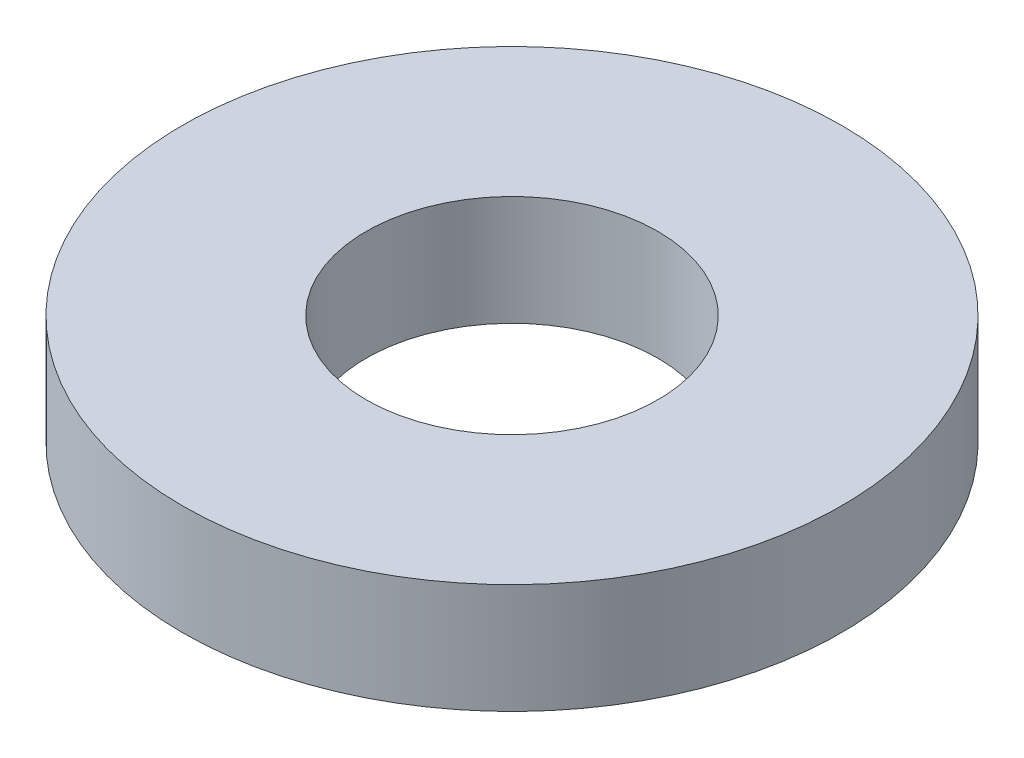
ISO-10303-21;
HEADER;
FILE_DESCRIPTION(('STEP AP214'),'2;1');
FILE_NAME('part.step','',(''),(''),'','','');
FILE_SCHEMA(('AUTOMOTIVE_DESIGN { 1 0 10303 214 1 1 1 1 }'));
ENDSEC;
DATA;
#1=APPLICATION_CONTEXT('core data for automotive mechanical design processes');
#2=APPLICATION_PROTOCOL_DEFINITION('international standard','automotive_design',2000,#1);
#3=PRODUCT_CONTEXT('',#1,'mechanical');
#4=PRODUCT('Part','Part','',(#3));
#5=PRODUCT_RELATED_PRODUCT_CATEGORY('part','',(#4));
#6=PRODUCT_DEFINITION_FORMATION('','',#4);
#7=PRODUCT_DEFINITION_CONTEXT('part definition',#1,'design');
#8=PRODUCT_DEFINITION('design','',#6,#7);
#9=PRODUCT_DEFINITION_SHAPE('','',#8);
#10=(LENGTH_UNIT() NAMED_UNIT(*) SI_UNIT(.MILLI.,.METRE.));
#11=(NAMED_UNIT(*) PLANE_ANGLE_UNIT() SI_UNIT($,.RADIAN.));
#12=(NAMED_UNIT(*) SI_UNIT($,.STERADIAN.) SOLID_ANGLE_UNIT());
#13=UNCERTAINTY_MEASURE_WITH_UNIT(LENGTH_MEASURE(1.E-05),#10,'distance_accuracy_value','');
#14=(GEOMETRIC_REPRESENTATION_CONTEXT(3) GLOBAL_UNCERTAINTY_ASSIGNED_CONTEXT((#13)) GLOBAL_UNIT_ASSIGNED_CONTEXT((#10,
#11,#12)) REPRESENTATION_CONTEXT('',''));
#15=CARTESIAN_POINT('',(0.,0.,0.));
#16=DIRECTION('',(0.,0.,1.));
#17=DIRECTION('',(1.,0.,0.));
#18=AXIS2_PLACEMENT_3D('',#15,#16,#17);
#19=CARTESIAN_POINT('',(0.,1.5875,0.));
#20=DIRECTION('',(0.,1.,0.));
#21=DIRECTION('',(0.,0.,1.));
#22=AXIS2_PLACEMENT_3D('',#19,#20,#21);
#23=PLANE('',#22);
#24=CARTESIAN_POINT('',(0.,1.5875,0.));
#25=DIRECTION('',(0.,1.,0.));
#26=DIRECTION('',(0.,0.,1.));
#27=AXIS2_PLACEMENT_3D('',#24,#25,#26);
#28=CIRCLE('',#27,4.7625);
#29=CARTESIAN_POINT('',(0.,1.5875,4.7625));
#30=VERTEX_POINT('',#29);
#31=EDGE_CURVE('E10',#30,#30,#28,.T.);
#32=ORIENTED_EDGE('',*,*,#31,.T.);
#33=EDGE_LOOP('',(#32));
#34=FACE_BOUND('',#33,.T.);
#35=CARTESIAN_POINT('',(0.,1.5875,0.));
#36=DIRECTION('',(0.,1.,0.));
#37=DIRECTION('',(0.,0.,1.));
#38=AXIS2_PLACEMENT_3D('',#35,#36,#37);
#39=CIRCLE('',#38,2.1082);
#40=CARTESIAN_POINT('',(0.,1.5875,2.1082));
#41=VERTEX_POINT('',#40);
#42=EDGE_CURVE('E45',#41,#41,#39,.T.);
#43=ORIENTED_EDGE('',*,*,#42,.F.);
#44=EDGE_LOOP('',(#43));
#45=FACE_BOUND('',#44,.T.);
#46=ADVANCED_FACE('F34',(#34,#45),#23,.T.);
#47=CARTESIAN_POINT('',(0.,0.,0.));
#48=DIRECTION('',(0.,1.,0.));
#49=DIRECTION('',(0.,0.,1.));
#50=AXIS2_PLACEMENT_3D('',#47,#48,#49);
#51=PLANE('',#50);
#52=CARTESIAN_POINT('',(0.,0.,0.));
#53=DIRECTION('',(0.,1.,0.));
#54=DIRECTION('',(0.,0.,1.));
#55=AXIS2_PLACEMENT_3D('',#52,#53,#54);
#56=CIRCLE('',#55,4.7625);
#57=CARTESIAN_POINT('',(0.,0.,4.7625));
#58=VERTEX_POINT('',#57);
#59=EDGE_CURVE('E38',#58,#58,#56,.T.);
#60=ORIENTED_EDGE('',*,*,#59,.F.);
#61=EDGE_LOOP('',(#60));
#62=FACE_BOUND('',#61,.T.);
#63=CARTESIAN_POINT('',(0.,0.,0.));
#64=DIRECTION('',(0.,1.,0.));
#65=DIRECTION('',(0.,0.,1.));
#66=AXIS2_PLACEMENT_3D('',#63,#64,#65);
#67=CIRCLE('',#66,2.1082);
#68=CARTESIAN_POINT('',(0.,0.,2.1082));
#69=VERTEX_POINT('',#68);
#70=EDGE_CURVE('E47',#69,#69,#67,.T.);
#71=ORIENTED_EDGE('',*,*,#70,.T.);
#72=EDGE_LOOP('',(#71));
#73=FACE_BOUND('',#72,.T.);
#74=ADVANCED_FACE('F57',(#62,#73),#51,.F.);
#75=CARTESIAN_POINT('',(0.,1.5875,0.));
#76=DIRECTION('',(0.,-1.,0.));
#77=DIRECTION('',(0.,0.,-1.));
#78=AXIS2_PLACEMENT_3D('',#75,#76,#77);
#79=CYLINDRICAL_SURFACE('',#78,4.7625);
#80=ORIENTED_EDGE('',*,*,#31,.F.);
#81=EDGE_LOOP('',(#80));
#82=FACE_BOUND('',#81,.T.);
#83=ORIENTED_EDGE('',*,*,#59,.T.);
#84=EDGE_LOOP('',(#83));
#85=FACE_BOUND('',#84,.T.);
#86=ADVANCED_FACE('F36',(#82,#85),#79,.T.);
#87=CARTESIAN_POINT('',(0.,1.5875,0.));
#88=DIRECTION('',(0.,-1.,0.));
#89=DIRECTION('',(0.,0.,-1.));
#90=AXIS2_PLACEMENT_3D('',#87,#88,#89);
#91=CYLINDRICAL_SURFACE('',#90,2.1082);
#92=ORIENTED_EDGE('',*,*,#42,.T.);
#93=EDGE_LOOP('',(#92));
#94=FACE_BOUND('',#93,.T.);
#95=ORIENTED_EDGE('',*,*,#70,.F.);
#96=EDGE_LOOP('',(#95));
#97=FACE_BOUND('',#96,.T.);
#98=ADVANCED_FACE('F53',(#94,#97),#91,.F.);
#99=CLOSED_SHELL('',(#46,#74,#86,#98));
#100=MANIFOLD_SOLID_BREP('B2',#99);
#101=ADVANCED_BREP_SHAPE_REPRESENTATION('',(#18,#100),#14);
#102=SHAPE_DEFINITION_REPRESENTATION(#9,#101);
ENDSEC;
END-ISO-10303-21;
